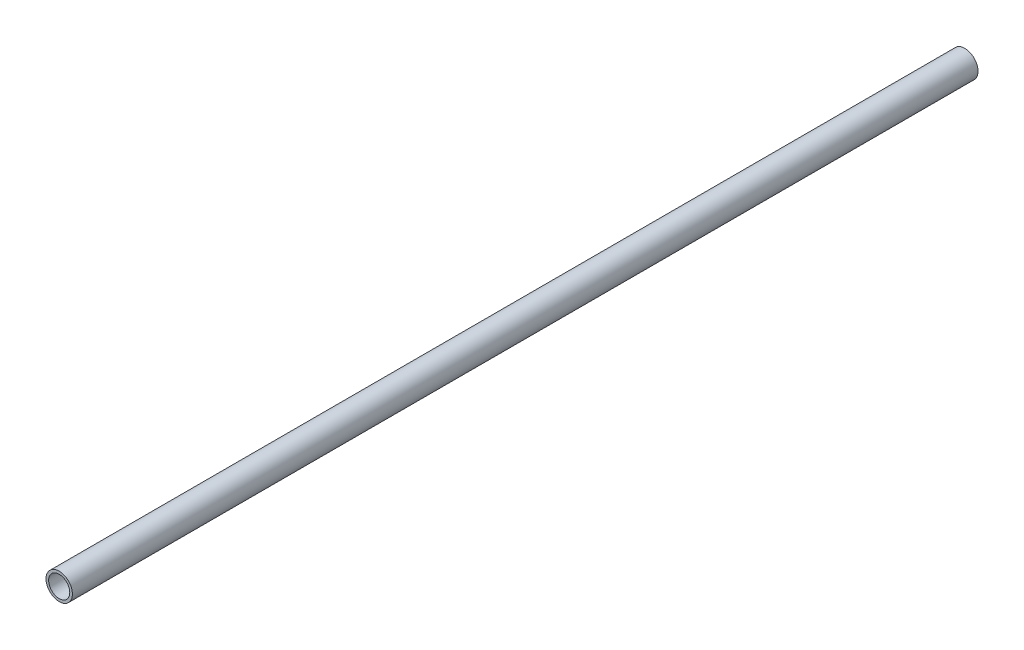
ISO-10303-21;
HEADER;
FILE_DESCRIPTION(('STEP AP214'),'2;1');
FILE_NAME('part.step','',(''),(''),'','','');
FILE_SCHEMA(('AUTOMOTIVE_DESIGN { 1 0 10303 214 1 1 1 1 }'));
ENDSEC;
DATA;
#1=APPLICATION_CONTEXT('core data for automotive mechanical design processes');
#2=APPLICATION_PROTOCOL_DEFINITION('international standard','automotive_design',2000,#1);
#3=PRODUCT_CONTEXT('',#1,'mechanical');
#4=PRODUCT('Part','Part','',(#3));
#5=PRODUCT_RELATED_PRODUCT_CATEGORY('part','',(#4));
#6=PRODUCT_DEFINITION_FORMATION('','',#4);
#7=PRODUCT_DEFINITION_CONTEXT('part definition',#1,'design');
#8=PRODUCT_DEFINITION('design','',#6,#7);
#9=PRODUCT_DEFINITION_SHAPE('','',#8);
#10=(LENGTH_UNIT() NAMED_UNIT(*) SI_UNIT(.MILLI.,.METRE.));
#11=(NAMED_UNIT(*) PLANE_ANGLE_UNIT() SI_UNIT($,.RADIAN.));
#12=(NAMED_UNIT(*) SI_UNIT($,.STERADIAN.) SOLID_ANGLE_UNIT());
#13=UNCERTAINTY_MEASURE_WITH_UNIT(LENGTH_MEASURE(1.E-05),#10,'distance_accuracy_value','');
#14=(GEOMETRIC_REPRESENTATION_CONTEXT(3) GLOBAL_UNCERTAINTY_ASSIGNED_CONTEXT((#13)) GLOBAL_UNIT_ASSIGNED_CONTEXT((#10,
#11,#12)) REPRESENTATION_CONTEXT('',''));
#15=CARTESIAN_POINT('',(0.,0.,0.));
#16=DIRECTION('',(0.,0.,1.));
#17=DIRECTION('',(1.,0.,0.));
#18=AXIS2_PLACEMENT_3D('',#15,#16,#17);
#19=CARTESIAN_POINT('',(0.,0.,300.));
#20=DIRECTION('',(0.,0.,-1.));
#21=DIRECTION('',(-1.,0.,0.));
#22=AXIS2_PLACEMENT_3D('',#19,#20,#21);
#23=CYLINDRICAL_SURFACE('',#22,4.);
#24=CARTESIAN_POINT('',(0.,0.,343.));
#25=DIRECTION('',(0.,0.,1.));
#26=DIRECTION('',(1.,0.,0.));
#27=AXIS2_PLACEMENT_3D('',#24,#25,#26);
#28=CIRCLE('',#27,4.);
#29=CARTESIAN_POINT('',(4.,0.,343.));
#30=VERTEX_POINT('',#29);
#31=EDGE_CURVE('E46',#30,#30,#28,.F.);
#32=ORIENTED_EDGE('',*,*,#31,.F.);
#33=EDGE_LOOP('',(#32));
#34=FACE_BOUND('',#33,.T.);
#35=CARTESIAN_POINT('',(0.,0.,0.));
#36=DIRECTION('',(0.,0.,-1.));
#37=DIRECTION('',(-1.,0.,0.));
#38=AXIS2_PLACEMENT_3D('',#35,#36,#37);
#39=CIRCLE('',#38,4.);
#40=CARTESIAN_POINT('',(-4.,0.,0.));
#41=VERTEX_POINT('',#40);
#42=EDGE_CURVE('E55',#41,#41,#39,.T.);
#43=ORIENTED_EDGE('',*,*,#42,.T.);
#44=EDGE_LOOP('',(#43));
#45=FACE_BOUND('',#44,.T.);
#46=ADVANCED_FACE('F42',(#34,#45),#23,.F.);
#47=CARTESIAN_POINT('',(-5.06,-5.06,343.));
#48=DIRECTION('',(0.,0.,1.));
#49=DIRECTION('',(1.,0.,0.));
#50=AXIS2_PLACEMENT_3D('',#47,#48,#49);
#51=PLANE('',#50);
#52=CARTESIAN_POINT('',(0.,0.,343.));
#53=DIRECTION('',(0.,0.,1.));
#54=DIRECTION('',(1.,0.,0.));
#55=AXIS2_PLACEMENT_3D('',#52,#53,#54);
#56=CIRCLE('',#55,5.);
#57=CARTESIAN_POINT('',(5.,0.,343.));
#58=VERTEX_POINT('',#57);
#59=EDGE_CURVE('E50',#58,#58,#56,.F.);
#60=ORIENTED_EDGE('',*,*,#59,.F.);
#61=EDGE_LOOP('',(#60));
#62=FACE_BOUND('',#61,.T.);
#63=ORIENTED_EDGE('',*,*,#31,.T.);
#64=EDGE_LOOP('',(#63));
#65=FACE_BOUND('',#64,.T.);
#66=ADVANCED_FACE('F44',(#62,#65),#51,.T.);
#67=CARTESIAN_POINT('',(-5.06,-5.06,0.));
#68=DIRECTION('',(0.,0.,1.));
#69=DIRECTION('',(1.,0.,0.));
#70=AXIS2_PLACEMENT_3D('',#67,#68,#69);
#71=PLANE('',#70);
#72=CARTESIAN_POINT('',(0.,0.,0.));
#73=DIRECTION('',(0.,0.,-1.));
#74=DIRECTION('',(-1.,0.,0.));
#75=AXIS2_PLACEMENT_3D('',#72,#73,#74);
#76=CIRCLE('',#75,5.);
#77=CARTESIAN_POINT('',(-5.,0.,0.));
#78=VERTEX_POINT('',#77);
#79=EDGE_CURVE('E11',#78,#78,#76,.F.);
#80=ORIENTED_EDGE('',*,*,#79,.F.);
#81=EDGE_LOOP('',(#80));
#82=FACE_BOUND('',#81,.T.);
#83=ORIENTED_EDGE('',*,*,#42,.F.);
#84=EDGE_LOOP('',(#83));
#85=FACE_BOUND('',#84,.T.);
#86=ADVANCED_FACE('F69',(#82,#85),#71,.F.);
#87=CARTESIAN_POINT('',(0.,0.,300.));
#88=DIRECTION('',(0.,0.,-1.));
#89=DIRECTION('',(-1.,0.,0.));
#90=AXIS2_PLACEMENT_3D('',#87,#88,#89);
#91=CYLINDRICAL_SURFACE('',#90,5.);
#92=ORIENTED_EDGE('',*,*,#79,.T.);
#93=EDGE_LOOP('',(#92));
#94=FACE_BOUND('',#93,.T.);
#95=ORIENTED_EDGE('',*,*,#59,.T.);
#96=EDGE_LOOP('',(#95));
#97=FACE_BOUND('',#96,.T.);
#98=ADVANCED_FACE('F72',(#94,#97),#91,.T.);
#99=CLOSED_SHELL('',(#46,#66,#86,#98));
#100=MANIFOLD_SOLID_BREP('B2',#99);
#101=ADVANCED_BREP_SHAPE_REPRESENTATION('',(#18,#100),#14);
#102=SHAPE_DEFINITION_REPRESENTATION(#9,#101);
ENDSEC;
END-ISO-10303-21;
